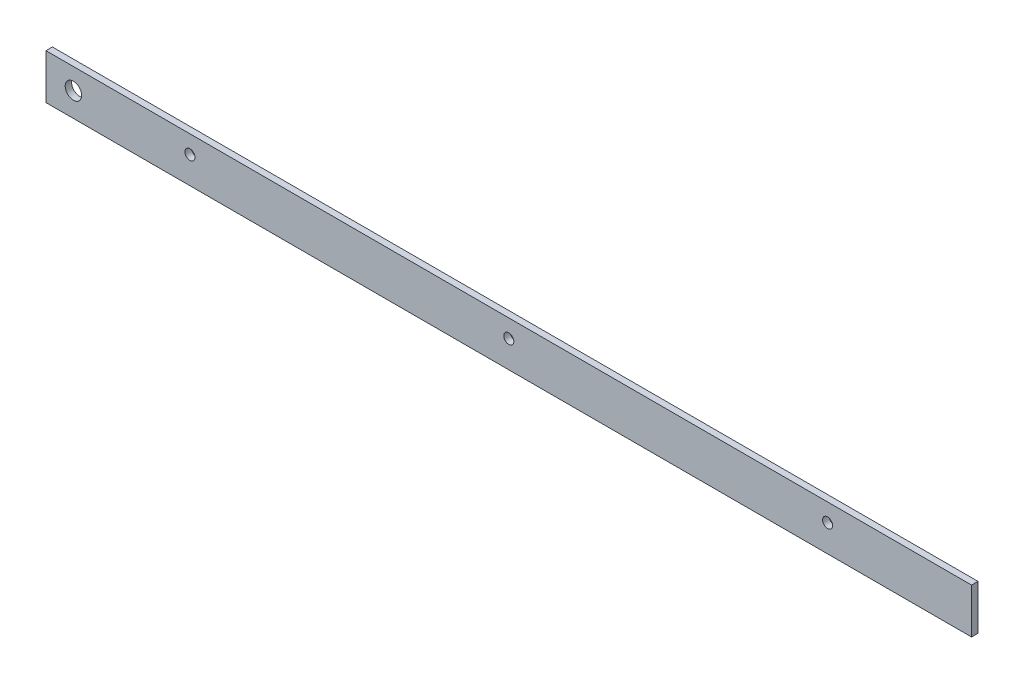
ISO-10303-21;
HEADER;
FILE_DESCRIPTION(('STEP AP214'),'2;1');
FILE_NAME('part.step','',(''),(''),'','','');
FILE_SCHEMA(('AUTOMOTIVE_DESIGN { 1 0 10303 214 1 1 1 1 }'));
ENDSEC;
DATA;
#1=APPLICATION_CONTEXT('core data for automotive mechanical design processes');
#2=APPLICATION_PROTOCOL_DEFINITION('international standard','automotive_design',2000,#1);
#3=PRODUCT_CONTEXT('',#1,'mechanical');
#4=PRODUCT('Part','Part','',(#3));
#5=PRODUCT_RELATED_PRODUCT_CATEGORY('part','',(#4));
#6=PRODUCT_DEFINITION_FORMATION('','',#4);
#7=PRODUCT_DEFINITION_CONTEXT('part definition',#1,'design');
#8=PRODUCT_DEFINITION('design','',#6,#7);
#9=PRODUCT_DEFINITION_SHAPE('','',#8);
#10=(LENGTH_UNIT() NAMED_UNIT(*) SI_UNIT(.MILLI.,.METRE.));
#11=(NAMED_UNIT(*) PLANE_ANGLE_UNIT() SI_UNIT($,.RADIAN.));
#12=(NAMED_UNIT(*) SI_UNIT($,.STERADIAN.) SOLID_ANGLE_UNIT());
#13=UNCERTAINTY_MEASURE_WITH_UNIT(LENGTH_MEASURE(1.E-05),#10,'distance_accuracy_value','');
#14=(GEOMETRIC_REPRESENTATION_CONTEXT(3) GLOBAL_UNCERTAINTY_ASSIGNED_CONTEXT((#13)) GLOBAL_UNIT_ASSIGNED_CONTEXT((#10,
#11,#12)) REPRESENTATION_CONTEXT('',''));
#15=CARTESIAN_POINT('',(0.,0.,0.));
#16=DIRECTION('',(0.,0.,1.));
#17=DIRECTION('',(1.,0.,0.));
#18=AXIS2_PLACEMENT_3D('',#15,#16,#17);
#19=CARTESIAN_POINT('',(-1.23531895766701E-13,17.3919880288977,3.175));
#20=DIRECTION('',(0.,1.,0.));
#21=DIRECTION('',(-1.,0.,0.));
#22=AXIS2_PLACEMENT_3D('',#19,#20,#21);
#23=PLANE('',#22);
#24=DIRECTION('',(1.,0.,0.));
#25=VECTOR('',#24,1.);
#26=CARTESIAN_POINT('',(-1.23531895766701E-13,17.3919880288977,0.));
#27=LINE('',#26,#25);
#28=CARTESIAN_POINT('',(0.,17.3919880289008,0.));
#29=VERTEX_POINT('',#28);
#30=CARTESIAN_POINT('',(457.2,17.3919880289008,0.));
#31=VERTEX_POINT('',#30);
#32=EDGE_CURVE('E101',#29,#31,#27,.T.);
#33=ORIENTED_EDGE('',*,*,#32,.F.);
#34=DIRECTION('',(0.,0.,-1.));
#35=VECTOR('',#34,1.);
#36=CARTESIAN_POINT('',(0.,17.3919880289008,3.175));
#37=LINE('',#36,#35);
#38=CARTESIAN_POINT('',(0.,17.3919880289008,3.175));
#39=VERTEX_POINT('',#38);
#40=EDGE_CURVE('E11',#39,#29,#37,.T.);
#41=ORIENTED_EDGE('',*,*,#40,.F.);
#42=DIRECTION('',(1.,0.,0.));
#43=VECTOR('',#42,1.);
#44=CARTESIAN_POINT('',(-1.23531895766701E-13,17.3919880288977,3.175));
#45=LINE('',#44,#43);
#46=CARTESIAN_POINT('',(457.2,17.3919880289008,3.175));
#47=VERTEX_POINT('',#46);
#48=EDGE_CURVE('E87',#39,#47,#45,.T.);
#49=ORIENTED_EDGE('',*,*,#48,.T.);
#50=DIRECTION('',(0.,0.,1.));
#51=VECTOR('',#50,1.);
#52=CARTESIAN_POINT('',(457.2,17.3919880289008,0.));
#53=LINE('',#52,#51);
#54=EDGE_CURVE('E93',#31,#47,#53,.T.);
#55=ORIENTED_EDGE('',*,*,#54,.F.);
#56=EDGE_LOOP('',(#33,#41,#49,#55));
#57=FACE_BOUND('',#56,.T.);
#58=ADVANCED_FACE('F41',(#57),#23,.T.);
#59=CARTESIAN_POINT('',(0.,0.,3.175));
#60=DIRECTION('',(-1.,0.,0.));
#61=DIRECTION('',(0.,-1.,0.));
#62=AXIS2_PLACEMENT_3D('',#59,#60,#61);
#63=PLANE('',#62);
#64=DIRECTION('',(0.,1.,0.));
#65=VECTOR('',#64,1.);
#66=CARTESIAN_POINT('',(0.,0.,0.));
#67=LINE('',#66,#65);
#68=CARTESIAN_POINT('',(0.,-4.83301197109929,0.));
#69=VERTEX_POINT('',#68);
#70=EDGE_CURVE('E103',#69,#29,#67,.T.);
#71=ORIENTED_EDGE('',*,*,#70,.F.);
#72=DIRECTION('',(0.,0.,-1.));
#73=VECTOR('',#72,1.);
#74=CARTESIAN_POINT('',(0.,-4.83301197109929,3.175));
#75=LINE('',#74,#73);
#76=CARTESIAN_POINT('',(0.,-4.83301197109929,3.175));
#77=VERTEX_POINT('',#76);
#78=EDGE_CURVE('E49',#77,#69,#75,.T.);
#79=ORIENTED_EDGE('',*,*,#78,.F.);
#80=DIRECTION('',(0.,1.,0.));
#81=VECTOR('',#80,1.);
#82=CARTESIAN_POINT('',(0.,0.,3.175));
#83=LINE('',#82,#81);
#84=EDGE_CURVE('E94',#77,#39,#83,.T.);
#85=ORIENTED_EDGE('',*,*,#84,.T.);
#86=ORIENTED_EDGE('',*,*,#40,.T.);
#87=EDGE_LOOP('',(#71,#79,#85,#86));
#88=FACE_BOUND('',#87,.T.);
#89=ADVANCED_FACE('F150',(#88),#63,.T.);
#90=CARTESIAN_POINT('',(0.,-4.83301197109929,3.175));
#91=DIRECTION('',(0.,1.,0.));
#92=DIRECTION('',(0.,0.,1.));
#93=AXIS2_PLACEMENT_3D('',#90,#91,#92);
#94=PLANE('',#93);
#95=DIRECTION('',(1.,0.,0.));
#96=VECTOR('',#95,1.);
#97=CARTESIAN_POINT('',(0.,-4.83301197109929,0.));
#98=LINE('',#97,#96);
#99=CARTESIAN_POINT('',(457.2,-4.83301197109929,0.));
#100=VERTEX_POINT('',#99);
#101=EDGE_CURVE('E121',#69,#100,#98,.T.);
#102=ORIENTED_EDGE('',*,*,#101,.T.);
#103=DIRECTION('',(0.,0.,-1.));
#104=VECTOR('',#103,1.);
#105=CARTESIAN_POINT('',(457.2,-4.83301197109929,3.175));
#106=LINE('',#105,#104);
#107=CARTESIAN_POINT('',(457.2,-4.83301197109929,3.175));
#108=VERTEX_POINT('',#107);
#109=EDGE_CURVE('E75',#108,#100,#106,.T.);
#110=ORIENTED_EDGE('',*,*,#109,.F.);
#111=DIRECTION('',(1.,0.,0.));
#112=VECTOR('',#111,1.);
#113=CARTESIAN_POINT('',(0.,-4.83301197109929,3.175));
#114=LINE('',#113,#112);
#115=EDGE_CURVE('E57',#77,#108,#114,.T.);
#116=ORIENTED_EDGE('',*,*,#115,.F.);
#117=ORIENTED_EDGE('',*,*,#78,.T.);
#118=EDGE_LOOP('',(#102,#110,#116,#117));
#119=FACE_BOUND('',#118,.T.);
#120=ADVANCED_FACE('F156',(#119),#94,.F.);
#121=CARTESIAN_POINT('',(386.08,8.5094880289007,3.175));
#122=DIRECTION('',(0.,0.,-1.));
#123=DIRECTION('',(-1.,0.,0.));
#124=AXIS2_PLACEMENT_3D('',#121,#122,#123);
#125=CYLINDRICAL_SURFACE('',#124,2.48920000000001);
#126=CARTESIAN_POINT('',(386.08,8.5094880289007,3.175));
#127=DIRECTION('',(0.,0.,1.));
#128=DIRECTION('',(1.,0.,0.));
#129=AXIS2_PLACEMENT_3D('',#126,#127,#128);
#130=CIRCLE('',#129,2.48920000000001);
#131=CARTESIAN_POINT('',(388.5692,8.5094880289007,3.175));
#132=VERTEX_POINT('',#131);
#133=EDGE_CURVE('E113',#132,#132,#130,.T.);
#134=ORIENTED_EDGE('',*,*,#133,.T.);
#135=EDGE_LOOP('',(#134));
#136=FACE_BOUND('',#135,.T.);
#137=CARTESIAN_POINT('',(386.08,8.5094880289007,0.));
#138=DIRECTION('',(0.,0.,1.));
#139=DIRECTION('',(1.,0.,0.));
#140=AXIS2_PLACEMENT_3D('',#137,#138,#139);
#141=CIRCLE('',#140,2.48920000000001);
#142=CARTESIAN_POINT('',(388.5692,8.5094880289007,0.));
#143=VERTEX_POINT('',#142);
#144=EDGE_CURVE('E130',#143,#143,#141,.T.);
#145=ORIENTED_EDGE('',*,*,#144,.F.);
#146=EDGE_LOOP('',(#145));
#147=FACE_BOUND('',#146,.T.);
#148=ADVANCED_FACE('F161',(#136,#147),#125,.F.);
#149=CARTESIAN_POINT('',(228.6,8.5094880289007,3.175));
#150=DIRECTION('',(0.,0.,-1.));
#151=DIRECTION('',(-1.,0.,0.));
#152=AXIS2_PLACEMENT_3D('',#149,#150,#151);
#153=CYLINDRICAL_SURFACE('',#152,2.4892);
#154=CARTESIAN_POINT('',(228.6,8.5094880289007,3.175));
#155=DIRECTION('',(0.,0.,1.));
#156=DIRECTION('',(1.,0.,0.));
#157=AXIS2_PLACEMENT_3D('',#154,#155,#156);
#158=CIRCLE('',#157,2.4892);
#159=CARTESIAN_POINT('',(231.0892,8.5094880289007,3.175));
#160=VERTEX_POINT('',#159);
#161=EDGE_CURVE('E110',#160,#160,#158,.T.);
#162=ORIENTED_EDGE('',*,*,#161,.T.);
#163=EDGE_LOOP('',(#162));
#164=FACE_BOUND('',#163,.T.);
#165=CARTESIAN_POINT('',(228.6,8.5094880289007,0.));
#166=DIRECTION('',(0.,0.,1.));
#167=DIRECTION('',(1.,0.,0.));
#168=AXIS2_PLACEMENT_3D('',#165,#166,#167);
#169=CIRCLE('',#168,2.4892);
#170=CARTESIAN_POINT('',(231.0892,8.5094880289007,0.));
#171=VERTEX_POINT('',#170);
#172=EDGE_CURVE('E127',#171,#171,#169,.T.);
#173=ORIENTED_EDGE('',*,*,#172,.F.);
#174=EDGE_LOOP('',(#173));
#175=FACE_BOUND('',#174,.T.);
#176=ADVANCED_FACE('F169',(#164,#175),#153,.F.);
#177=CARTESIAN_POINT('',(71.12,8.5094880289007,3.175));
#178=DIRECTION('',(0.,0.,-1.));
#179=DIRECTION('',(-1.,0.,0.));
#180=AXIS2_PLACEMENT_3D('',#177,#178,#179);
#181=CYLINDRICAL_SURFACE('',#180,2.4892);
#182=CARTESIAN_POINT('',(71.12,8.5094880289007,3.175));
#183=DIRECTION('',(0.,0.,1.));
#184=DIRECTION('',(1.,0.,0.));
#185=AXIS2_PLACEMENT_3D('',#182,#183,#184);
#186=CIRCLE('',#185,2.4892);
#187=CARTESIAN_POINT('',(73.6092,8.5094880289007,3.175));
#188=VERTEX_POINT('',#187);
#189=EDGE_CURVE('E90',#188,#188,#186,.T.);
#190=ORIENTED_EDGE('',*,*,#189,.T.);
#191=EDGE_LOOP('',(#190));
#192=FACE_BOUND('',#191,.T.);
#193=CARTESIAN_POINT('',(71.12,8.5094880289007,0.));
#194=DIRECTION('',(0.,0.,1.));
#195=DIRECTION('',(1.,0.,0.));
#196=AXIS2_PLACEMENT_3D('',#193,#194,#195);
#197=CIRCLE('',#196,2.4892);
#198=CARTESIAN_POINT('',(73.6092,8.5094880289007,0.));
#199=VERTEX_POINT('',#198);
#200=EDGE_CURVE('E124',#199,#199,#197,.T.);
#201=ORIENTED_EDGE('',*,*,#200,.F.);
#202=EDGE_LOOP('',(#201));
#203=FACE_BOUND('',#202,.T.);
#204=ADVANCED_FACE('F166',(#192,#203),#181,.F.);
#205=CARTESIAN_POINT('',(457.2,7.10915919970058E-12,3.175));
#206=DIRECTION('',(1.,0.,0.));
#207=DIRECTION('',(0.,1.,0.));
#208=AXIS2_PLACEMENT_3D('',#205,#206,#207);
#209=PLANE('',#208);
#210=DIRECTION('',(0.,-1.,0.));
#211=VECTOR('',#210,1.);
#212=CARTESIAN_POINT('',(457.2,7.10915919970058E-12,0.));
#213=LINE('',#212,#211);
#214=EDGE_CURVE('E99',#31,#100,#213,.T.);
#215=ORIENTED_EDGE('',*,*,#214,.F.);
#216=ORIENTED_EDGE('',*,*,#54,.T.);
#217=DIRECTION('',(0.,-1.,0.));
#218=VECTOR('',#217,1.);
#219=CARTESIAN_POINT('',(457.2,7.10915919970058E-12,3.175));
#220=LINE('',#219,#218);
#221=EDGE_CURVE('E84',#47,#108,#220,.T.);
#222=ORIENTED_EDGE('',*,*,#221,.T.);
#223=ORIENTED_EDGE('',*,*,#109,.T.);
#224=EDGE_LOOP('',(#215,#216,#222,#223));
#225=FACE_BOUND('',#224,.T.);
#226=ADVANCED_FACE('F97',(#225),#209,.T.);
#227=CARTESIAN_POINT('',(13.54,7.02698802890071,3.175));
#228=DIRECTION('',(0.,0.,-1.));
#229=DIRECTION('',(-1.,0.,0.));
#230=AXIS2_PLACEMENT_3D('',#227,#228,#229);
#231=CYLINDRICAL_SURFACE('',#230,4.0635);
#232=CARTESIAN_POINT('',(13.54,7.02698802890071,3.175));
#233=DIRECTION('',(0.,0.,1.));
#234=DIRECTION('',(1.,0.,0.));
#235=AXIS2_PLACEMENT_3D('',#232,#233,#234);
#236=CIRCLE('',#235,4.0635);
#237=CARTESIAN_POINT('',(17.6035,7.02698802890071,3.175));
#238=VERTEX_POINT('',#237);
#239=EDGE_CURVE('E116',#238,#238,#236,.F.);
#240=ORIENTED_EDGE('',*,*,#239,.F.);
#241=EDGE_LOOP('',(#240));
#242=FACE_BOUND('',#241,.T.);
#243=CARTESIAN_POINT('',(13.54,7.02698802890071,0.));
#244=DIRECTION('',(0.,0.,1.));
#245=DIRECTION('',(1.,0.,0.));
#246=AXIS2_PLACEMENT_3D('',#243,#244,#245);
#247=CIRCLE('',#246,4.0635);
#248=CARTESIAN_POINT('',(17.6035,7.02698802890071,0.));
#249=VERTEX_POINT('',#248);
#250=EDGE_CURVE('E95',#249,#249,#247,.F.);
#251=ORIENTED_EDGE('',*,*,#250,.T.);
#252=EDGE_LOOP('',(#251));
#253=FACE_BOUND('',#252,.T.);
#254=ADVANCED_FACE('F137',(#242,#253),#231,.F.);
#255=CARTESIAN_POINT('',(0.,0.,3.175));
#256=DIRECTION('',(0.,0.,1.));
#257=DIRECTION('',(1.,0.,0.));
#258=AXIS2_PLACEMENT_3D('',#255,#256,#257);
#259=PLANE('',#258);
#260=ORIENTED_EDGE('',*,*,#221,.F.);
#261=ORIENTED_EDGE('',*,*,#48,.F.);
#262=ORIENTED_EDGE('',*,*,#84,.F.);
#263=ORIENTED_EDGE('',*,*,#115,.T.);
#264=EDGE_LOOP('',(#260,#261,#262,#263));
#265=FACE_BOUND('',#264,.T.);
#266=ORIENTED_EDGE('',*,*,#189,.F.);
#267=EDGE_LOOP('',(#266));
#268=FACE_BOUND('',#267,.T.);
#269=ORIENTED_EDGE('',*,*,#161,.F.);
#270=EDGE_LOOP('',(#269));
#271=FACE_BOUND('',#270,.T.);
#272=ORIENTED_EDGE('',*,*,#133,.F.);
#273=EDGE_LOOP('',(#272));
#274=FACE_BOUND('',#273,.T.);
#275=ORIENTED_EDGE('',*,*,#239,.T.);
#276=EDGE_LOOP('',(#275));
#277=FACE_BOUND('',#276,.T.);
#278=ADVANCED_FACE('F85',(#265,#268,#271,#274,#277),#259,.T.);
#279=CARTESIAN_POINT('',(0.,0.,0.));
#280=DIRECTION('',(0.,0.,1.));
#281=DIRECTION('',(1.,0.,0.));
#282=AXIS2_PLACEMENT_3D('',#279,#280,#281);
#283=PLANE('',#282);
#284=ORIENTED_EDGE('',*,*,#32,.T.);
#285=ORIENTED_EDGE('',*,*,#214,.T.);
#286=ORIENTED_EDGE('',*,*,#101,.F.);
#287=ORIENTED_EDGE('',*,*,#70,.T.);
#288=EDGE_LOOP('',(#284,#285,#286,#287));
#289=FACE_BOUND('',#288,.T.);
#290=ORIENTED_EDGE('',*,*,#200,.T.);
#291=EDGE_LOOP('',(#290));
#292=FACE_BOUND('',#291,.T.);
#293=ORIENTED_EDGE('',*,*,#172,.T.);
#294=EDGE_LOOP('',(#293));
#295=FACE_BOUND('',#294,.T.);
#296=ORIENTED_EDGE('',*,*,#144,.T.);
#297=EDGE_LOOP('',(#296));
#298=FACE_BOUND('',#297,.T.);
#299=ORIENTED_EDGE('',*,*,#250,.F.);
#300=EDGE_LOOP('',(#299));
#301=FACE_BOUND('',#300,.T.);
#302=ADVANCED_FACE('F139',(#289,#292,#295,#298,#301),#283,.F.);
#303=CLOSED_SHELL('',(#58,#89,#120,#148,#176,#204,#226,#254,#278,#302));
#304=MANIFOLD_SOLID_BREP('B2',#303);
#305=ADVANCED_BREP_SHAPE_REPRESENTATION('',(#18,#304),#14);
#306=SHAPE_DEFINITION_REPRESENTATION(#9,#305);
ENDSEC;
END-ISO-10303-21;
